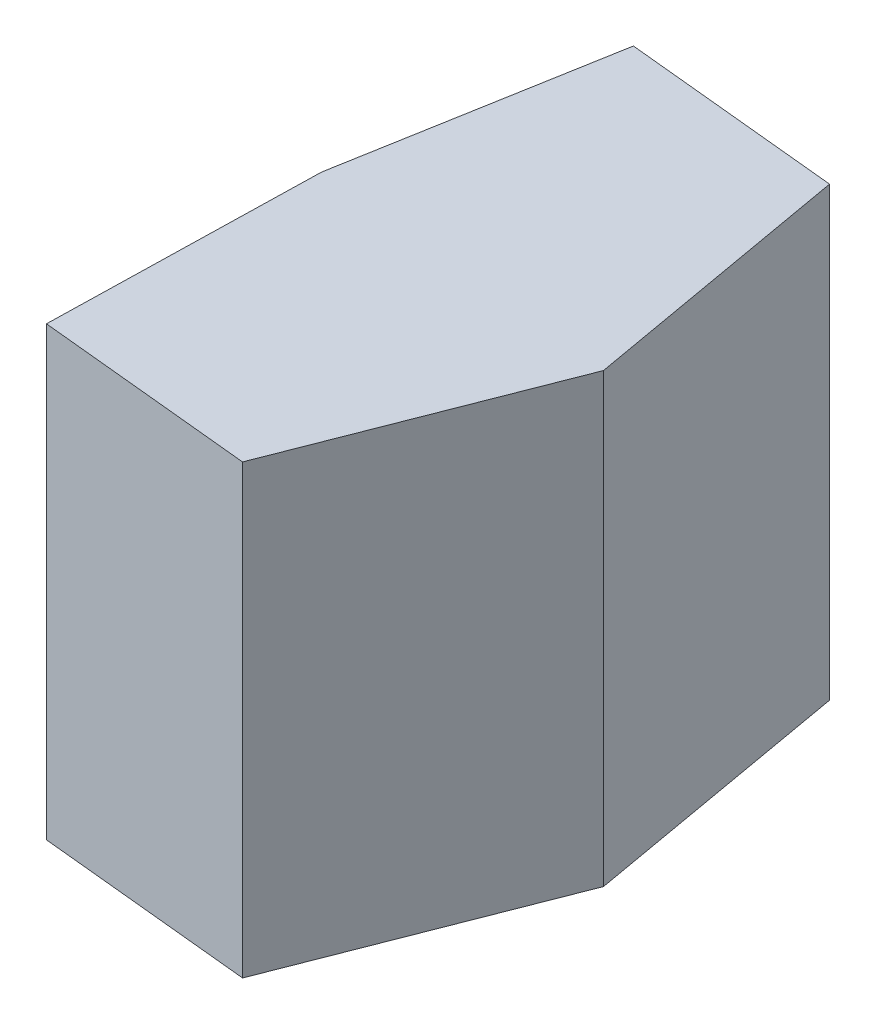
ISO-10303-21;
HEADER;
FILE_DESCRIPTION(('STEP AP214'),'2;1');
FILE_NAME('part.step','',(''),(''),'','','');
FILE_SCHEMA(('AUTOMOTIVE_DESIGN { 1 0 10303 214 1 1 1 1 }'));
ENDSEC;
DATA;
#1=APPLICATION_CONTEXT('core data for automotive mechanical design processes');
#2=APPLICATION_PROTOCOL_DEFINITION('international standard','automotive_design',2000,#1);
#3=PRODUCT_CONTEXT('',#1,'mechanical');
#4=PRODUCT('Part','Part','',(#3));
#5=PRODUCT_RELATED_PRODUCT_CATEGORY('part','',(#4));
#6=PRODUCT_DEFINITION_FORMATION('','',#4);
#7=PRODUCT_DEFINITION_CONTEXT('part definition',#1,'design');
#8=PRODUCT_DEFINITION('design','',#6,#7);
#9=PRODUCT_DEFINITION_SHAPE('','',#8);
#10=(LENGTH_UNIT() NAMED_UNIT(*) SI_UNIT(.MILLI.,.METRE.));
#11=(NAMED_UNIT(*) PLANE_ANGLE_UNIT() SI_UNIT($,.RADIAN.));
#12=(NAMED_UNIT(*) SI_UNIT($,.STERADIAN.) SOLID_ANGLE_UNIT());
#13=UNCERTAINTY_MEASURE_WITH_UNIT(LENGTH_MEASURE(1.E-05),#10,'distance_accuracy_value','');
#14=(GEOMETRIC_REPRESENTATION_CONTEXT(3) GLOBAL_UNCERTAINTY_ASSIGNED_CONTEXT((#13)) GLOBAL_UNIT_ASSIGNED_CONTEXT((#10,
#11,#12)) REPRESENTATION_CONTEXT('',''));
#15=CARTESIAN_POINT('',(0.,0.,0.));
#16=DIRECTION('',(0.,0.,1.));
#17=DIRECTION('',(1.,0.,0.));
#18=AXIS2_PLACEMENT_3D('',#15,#16,#17);
#19=CARTESIAN_POINT('',(-4.47018248166326,6.5,25.3516646386299));
#20=DIRECTION('',(0.984807753012207,0.,0.173648177666934));
#21=DIRECTION('',(0.173648177666934,0.,-0.984807753012208));
#22=AXIS2_PLACEMENT_3D('',#19,#20,#21);
#23=PLANE('',#22);
#24=DIRECTION('',(-0.173648177666934,0.,0.984807753012207));
#25=VECTOR('',#24,1.);
#26=CARTESIAN_POINT('',(-4.47018248166326,-6.5,25.3516646386299));
#27=LINE('',#26,#25);
#28=CARTESIAN_POINT('',(-3.11090546385127,-6.5,17.6428215996887));
#29=VERTEX_POINT('',#28);
#30=CARTESIAN_POINT('',(-4.47018248166326,-6.5,25.3516646386299));
#31=VERTEX_POINT('',#30);
#32=EDGE_CURVE('E134',#29,#31,#27,.T.);
#33=ORIENTED_EDGE('',*,*,#32,.T.);
#34=DIRECTION('',(0.,-1.,0.));
#35=VECTOR('',#34,1.);
#36=CARTESIAN_POINT('',(-4.47018248166326,6.5,25.3516646386299));
#37=LINE('',#36,#35);
#38=CARTESIAN_POINT('',(-4.47018248166326,6.5,25.3516646386299));
#39=VERTEX_POINT('',#38);
#40=EDGE_CURVE('E131',#39,#31,#37,.T.);
#41=ORIENTED_EDGE('',*,*,#40,.F.);
#42=DIRECTION('',(-0.173648177666934,0.,0.984807753012207));
#43=VECTOR('',#42,1.);
#44=CARTESIAN_POINT('',(-4.47018248166326,6.5,25.3516646386299));
#45=LINE('',#44,#43);
#46=CARTESIAN_POINT('',(-3.11090546385127,6.5,17.6428215996887));
#47=VERTEX_POINT('',#46);
#48=EDGE_CURVE('E79',#47,#39,#45,.T.);
#49=ORIENTED_EDGE('',*,*,#48,.F.);
#50=DIRECTION('',(0.,-1.,0.));
#51=VECTOR('',#50,1.);
#52=CARTESIAN_POINT('',(-3.11090546385127,6.5,17.6428215996887));
#53=LINE('',#52,#51);
#54=EDGE_CURVE('E47',#47,#29,#53,.T.);
#55=ORIENTED_EDGE('',*,*,#54,.T.);
#56=EDGE_LOOP('',(#33,#41,#49,#55));
#57=FACE_BOUND('',#56,.T.);
#58=ADVANCED_FACE('F39',(#57),#23,.F.);
#59=CARTESIAN_POINT('',(3.22143338597694,6.5,18.2696565950008));
#60=DIRECTION('',(-0.984807753012209,0.,0.173648177666925));
#61=DIRECTION('',(0.173648177666925,0.,0.984807753012209));
#62=AXIS2_PLACEMENT_3D('',#59,#60,#61);
#63=PLANE('',#62);
#64=DIRECTION('',(-0.173648177666925,0.,-0.984807753012209));
#65=VECTOR('',#64,1.);
#66=CARTESIAN_POINT('',(3.22143338597694,-6.5,18.2696565950008));
#67=LINE('',#66,#65);
#68=CARTESIAN_POINT('',(4.62915444297856,-6.5,26.2532394326674));
#69=VERTEX_POINT('',#68);
#70=CARTESIAN_POINT('',(3.22143338597694,-6.5,18.2696565950008));
#71=VERTEX_POINT('',#70);
#72=EDGE_CURVE('E69',#69,#71,#67,.T.);
#73=ORIENTED_EDGE('',*,*,#72,.T.);
#74=DIRECTION('',(0.,-1.,0.));
#75=VECTOR('',#74,1.);
#76=CARTESIAN_POINT('',(3.22143338597694,6.5,18.2696565950008));
#77=LINE('',#76,#75);
#78=CARTESIAN_POINT('',(3.22143338597694,6.5,18.2696565950008));
#79=VERTEX_POINT('',#78);
#80=EDGE_CURVE('E11',#79,#71,#77,.T.);
#81=ORIENTED_EDGE('',*,*,#80,.F.);
#82=DIRECTION('',(-0.173648177666925,0.,-0.984807753012209));
#83=VECTOR('',#82,1.);
#84=CARTESIAN_POINT('',(3.22143338597694,6.5,18.2696565950008));
#85=LINE('',#84,#83);
#86=CARTESIAN_POINT('',(4.62915444297856,6.5,26.2532394326674));
#87=VERTEX_POINT('',#86);
#88=EDGE_CURVE('E136',#87,#79,#85,.T.);
#89=ORIENTED_EDGE('',*,*,#88,.F.);
#90=DIRECTION('',(0.,-1.,0.));
#91=VECTOR('',#90,1.);
#92=CARTESIAN_POINT('',(4.62915444297856,6.5,26.2532394326674));
#93=LINE('',#92,#91);
#94=EDGE_CURVE('E117',#87,#69,#93,.T.);
#95=ORIENTED_EDGE('',*,*,#94,.T.);
#96=EDGE_LOOP('',(#73,#81,#89,#95));
#97=FACE_BOUND('',#96,.T.);
#98=ADVANCED_FACE('F159',(#97),#63,.F.);
#99=CARTESIAN_POINT('',(-3.11090546385127,6.5,17.6428215996887));
#100=DIRECTION('',(-0.0985080307791015,0.,0.995136255932836));
#101=DIRECTION('',(0.995136255932836,0.,0.0985080307791016));
#102=AXIS2_PLACEMENT_3D('',#99,#100,#101);
#103=PLANE('',#102);
#104=DIRECTION('',(-0.995136255932836,0.,-0.0985080307791015));
#105=VECTOR('',#104,1.);
#106=CARTESIAN_POINT('',(-3.11090546385127,-6.5,17.6428215996887));
#107=LINE('',#106,#105);
#108=EDGE_CURVE('E74',#71,#29,#107,.T.);
#109=ORIENTED_EDGE('',*,*,#108,.T.);
#110=ORIENTED_EDGE('',*,*,#54,.F.);
#111=DIRECTION('',(-0.995136255932836,0.,-0.0985080307791015));
#112=VECTOR('',#111,1.);
#113=CARTESIAN_POINT('',(-3.11090546385127,6.5,17.6428215996887));
#114=LINE('',#113,#112);
#115=EDGE_CURVE('E55',#79,#47,#114,.T.);
#116=ORIENTED_EDGE('',*,*,#115,.F.);
#117=ORIENTED_EDGE('',*,*,#80,.T.);
#118=EDGE_LOOP('',(#109,#110,#116,#117));
#119=FACE_BOUND('',#118,.T.);
#120=ADVANCED_FACE('F164',(#119),#103,.F.);
#121=CARTESIAN_POINT('',(0.,6.5,0.));
#122=DIRECTION('',(0.,1.,0.));
#123=DIRECTION('',(0.,0.,1.));
#124=AXIS2_PLACEMENT_3D('',#121,#122,#123);
#125=PLANE('',#124);
#126=ORIENTED_EDGE('',*,*,#48,.T.);
#127=DIRECTION('',(0.0229831271970944,0.,-0.999735853045314));
#128=VECTOR('',#127,1.);
#129=CARTESIAN_POINT('',(-4.47018248166326,6.5,25.3516646386299));
#130=LINE('',#129,#128);
#131=CARTESIAN_POINT('',(-4.65008898581547,6.5,33.177361327101));
#132=VERTEX_POINT('',#131);
#133=EDGE_CURVE('E104',#132,#39,#130,.T.);
#134=ORIENTED_EDGE('',*,*,#133,.F.);
#135=DIRECTION('',(-0.995118312955795,0.,-0.0986891241222268));
#136=VECTOR('',#135,1.);
#137=CARTESIAN_POINT('',(-4.65008898581547,6.5,33.177361327101));
#138=LINE('',#137,#136);
#139=CARTESIAN_POINT('',(1.68213568767766,6.5,33.8053486715565));
#140=VERTEX_POINT('',#139);
#141=EDGE_CURVE('E97',#140,#132,#138,.T.);
#142=ORIENTED_EDGE('',*,*,#141,.F.);
#143=DIRECTION('',(-0.36352687477606,0.,0.931583711383765));
#144=VECTOR('',#143,1.);
#145=CARTESIAN_POINT('',(1.68213568767766,6.5,33.8053486715565));
#146=LINE('',#145,#144);
#147=EDGE_CURVE('E101',#87,#140,#146,.T.);
#148=ORIENTED_EDGE('',*,*,#147,.F.);
#149=ORIENTED_EDGE('',*,*,#88,.T.);
#150=ORIENTED_EDGE('',*,*,#115,.T.);
#151=EDGE_LOOP('',(#126,#134,#142,#148,#149,#150));
#152=FACE_BOUND('',#151,.T.);
#153=ADVANCED_FACE('F99',(#152),#125,.T.);
#154=CARTESIAN_POINT('',(0.,-6.5,0.));
#155=DIRECTION('',(0.,1.,0.));
#156=DIRECTION('',(0.,0.,1.));
#157=AXIS2_PLACEMENT_3D('',#154,#155,#156);
#158=PLANE('',#157);
#159=ORIENTED_EDGE('',*,*,#32,.F.);
#160=ORIENTED_EDGE('',*,*,#108,.F.);
#161=ORIENTED_EDGE('',*,*,#72,.F.);
#162=DIRECTION('',(-0.36352687477606,0.,0.931583711383765));
#163=VECTOR('',#162,1.);
#164=CARTESIAN_POINT('',(1.68213568767766,-6.5,33.8053486715565));
#165=LINE('',#164,#163);
#166=CARTESIAN_POINT('',(1.68213568767766,-6.5,33.8053486715565));
#167=VERTEX_POINT('',#166);
#168=EDGE_CURVE('E126',#69,#167,#165,.T.);
#169=ORIENTED_EDGE('',*,*,#168,.T.);
#170=DIRECTION('',(-0.995118312955795,0.,-0.0986891241222268));
#171=VECTOR('',#170,1.);
#172=CARTESIAN_POINT('',(-4.65008898581547,-6.5,33.177361327101));
#173=LINE('',#172,#171);
#174=CARTESIAN_POINT('',(-4.65008898581547,-6.5,33.177361327101));
#175=VERTEX_POINT('',#174);
#176=EDGE_CURVE('E113',#167,#175,#173,.T.);
#177=ORIENTED_EDGE('',*,*,#176,.T.);
#178=DIRECTION('',(0.0229831271970944,0.,-0.999735853045314));
#179=VECTOR('',#178,1.);
#180=CARTESIAN_POINT('',(-4.47018248166326,-6.5,25.3516646386299));
#181=LINE('',#180,#179);
#182=EDGE_CURVE('E123',#175,#31,#181,.T.);
#183=ORIENTED_EDGE('',*,*,#182,.T.);
#184=EDGE_LOOP('',(#159,#160,#161,#169,#177,#183));
#185=FACE_BOUND('',#184,.T.);
#186=ADVANCED_FACE('F144',(#185),#158,.F.);
#187=CARTESIAN_POINT('',(-4.47018248166326,6.5,25.3516646386299));
#188=DIRECTION('',(0.999735853045314,0.,0.0229831271970943));
#189=DIRECTION('',(-0.0229831271970944,0.,0.999735853045314));
#190=AXIS2_PLACEMENT_3D('',#187,#188,#189);
#191=PLANE('',#190);
#192=ORIENTED_EDGE('',*,*,#182,.F.);
#193=DIRECTION('',(0.,-1.,0.));
#194=VECTOR('',#193,1.);
#195=CARTESIAN_POINT('',(-4.65008898581547,6.5,33.177361327101));
#196=LINE('',#195,#194);
#197=EDGE_CURVE('E108',#132,#175,#196,.T.);
#198=ORIENTED_EDGE('',*,*,#197,.F.);
#199=ORIENTED_EDGE('',*,*,#133,.T.);
#200=ORIENTED_EDGE('',*,*,#40,.T.);
#201=EDGE_LOOP('',(#192,#198,#199,#200));
#202=FACE_BOUND('',#201,.T.);
#203=ADVANCED_FACE('F147',(#202),#191,.F.);
#204=CARTESIAN_POINT('',(1.68213568767766,6.5,33.8053486715565));
#205=DIRECTION('',(-0.931583711383765,0.,-0.36352687477606));
#206=DIRECTION('',(0.36352687477606,0.,-0.931583711383766));
#207=AXIS2_PLACEMENT_3D('',#204,#205,#206);
#208=PLANE('',#207);
#209=ORIENTED_EDGE('',*,*,#168,.F.);
#210=ORIENTED_EDGE('',*,*,#94,.F.);
#211=ORIENTED_EDGE('',*,*,#147,.T.);
#212=DIRECTION('',(0.,-1.,0.));
#213=VECTOR('',#212,1.);
#214=CARTESIAN_POINT('',(1.68213568767766,6.5,33.8053486715565));
#215=LINE('',#214,#213);
#216=EDGE_CURVE('E111',#140,#167,#215,.T.);
#217=ORIENTED_EDGE('',*,*,#216,.T.);
#218=EDGE_LOOP('',(#209,#210,#211,#217));
#219=FACE_BOUND('',#218,.T.);
#220=ADVANCED_FACE('F119',(#219),#208,.F.);
#221=CARTESIAN_POINT('',(-4.65008898581547,6.5,33.177361327101));
#222=DIRECTION('',(0.0986891241222269,0.,-0.995118312955795));
#223=DIRECTION('',(0.995118312955795,0.,0.0986891241222268));
#224=AXIS2_PLACEMENT_3D('',#221,#222,#223);
#225=PLANE('',#224);
#226=ORIENTED_EDGE('',*,*,#176,.F.);
#227=ORIENTED_EDGE('',*,*,#216,.F.);
#228=ORIENTED_EDGE('',*,*,#141,.T.);
#229=ORIENTED_EDGE('',*,*,#197,.T.);
#230=EDGE_LOOP('',(#226,#227,#228,#229));
#231=FACE_BOUND('',#230,.T.);
#232=ADVANCED_FACE('F112',(#231),#225,.F.);
#233=CLOSED_SHELL('',(#58,#98,#120,#153,#186,#203,#220,#232));
#234=MANIFOLD_SOLID_BREP('B2',#233);
#235=ADVANCED_BREP_SHAPE_REPRESENTATION('',(#18,#234),#14);
#236=SHAPE_DEFINITION_REPRESENTATION(#9,#235);
ENDSEC;
END-ISO-10303-21;
